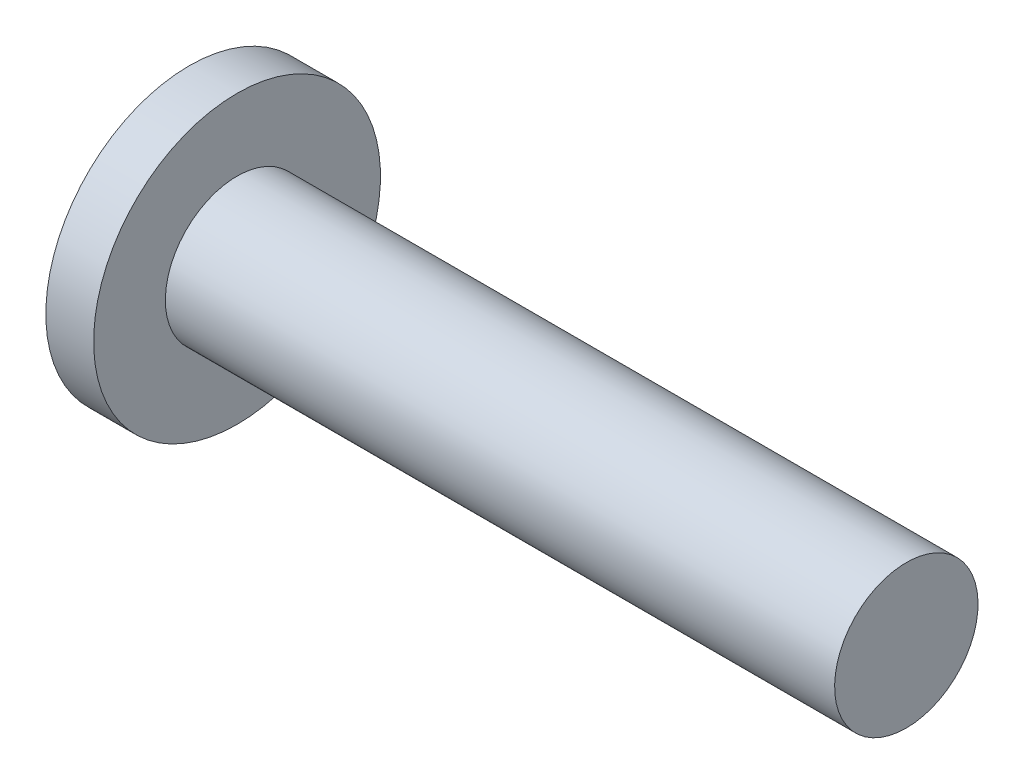
ISO-10303-21;
HEADER;
FILE_DESCRIPTION(('STEP AP214'),'2;1');
FILE_NAME('part.step','',(''),(''),'','','');
FILE_SCHEMA(('AUTOMOTIVE_DESIGN { 1 0 10303 214 1 1 1 1 }'));
ENDSEC;
DATA;
#1=APPLICATION_CONTEXT('core data for automotive mechanical design processes');
#2=APPLICATION_PROTOCOL_DEFINITION('international standard','automotive_design',2000,#1);
#3=PRODUCT_CONTEXT('',#1,'mechanical');
#4=PRODUCT('Part','Part','',(#3));
#5=PRODUCT_RELATED_PRODUCT_CATEGORY('part','',(#4));
#6=PRODUCT_DEFINITION_FORMATION('','',#4);
#7=PRODUCT_DEFINITION_CONTEXT('part definition',#1,'design');
#8=PRODUCT_DEFINITION('design','',#6,#7);
#9=PRODUCT_DEFINITION_SHAPE('','',#8);
#10=(LENGTH_UNIT() NAMED_UNIT(*) SI_UNIT(.MILLI.,.METRE.));
#11=(NAMED_UNIT(*) PLANE_ANGLE_UNIT() SI_UNIT($,.RADIAN.));
#12=(NAMED_UNIT(*) SI_UNIT($,.STERADIAN.) SOLID_ANGLE_UNIT());
#13=UNCERTAINTY_MEASURE_WITH_UNIT(LENGTH_MEASURE(1.E-05),#10,'distance_accuracy_value','');
#14=(GEOMETRIC_REPRESENTATION_CONTEXT(3) GLOBAL_UNCERTAINTY_ASSIGNED_CONTEXT((#13)) GLOBAL_UNIT_ASSIGNED_CONTEXT((#10,
#11,#12)) REPRESENTATION_CONTEXT('',''));
#15=CARTESIAN_POINT('',(0.,0.,0.));
#16=DIRECTION('',(0.,0.,1.));
#17=DIRECTION('',(1.,0.,0.));
#18=AXIS2_PLACEMENT_3D('',#15,#16,#17);
#19=CARTESIAN_POINT('',(0.,0.,0.));
#20=DIRECTION('',(-1.,0.,0.));
#21=DIRECTION('',(0.,-1.,0.));
#22=AXIS2_PLACEMENT_3D('',#19,#20,#21);
#23=PLANE('',#22);
#24=CARTESIAN_POINT('',(0.,-1.5,0.));
#25=DIRECTION('',(-1.,0.,0.));
#26=DIRECTION('',(0.,-1.,0.));
#27=AXIS2_PLACEMENT_3D('',#24,#25,#26);
#28=CIRCLE('',#27,3.);
#29=CARTESIAN_POINT('',(0.,-4.5,0.));
#30=VERTEX_POINT('',#29);
#31=EDGE_CURVE('E10',#30,#30,#28,.T.);
#32=ORIENTED_EDGE('',*,*,#31,.F.);
#33=EDGE_LOOP('',(#32));
#34=FACE_BOUND('',#33,.T.);
#35=CARTESIAN_POINT('',(0.,-1.5,0.));
#36=DIRECTION('',(-1.,0.,0.));
#37=DIRECTION('',(0.,-1.,0.));
#38=AXIS2_PLACEMENT_3D('',#35,#36,#37);
#39=CIRCLE('',#38,1.5);
#40=CARTESIAN_POINT('',(0.,-3.,0.));
#41=VERTEX_POINT('',#40);
#42=EDGE_CURVE('E51',#41,#41,#39,.T.);
#43=ORIENTED_EDGE('',*,*,#42,.T.);
#44=EDGE_LOOP('',(#43));
#45=FACE_BOUND('',#44,.T.);
#46=ADVANCED_FACE('F37',(#34,#45),#23,.F.);
#47=CARTESIAN_POINT('',(-1.,-1.5,0.));
#48=DIRECTION('',(-1.,0.,0.));
#49=DIRECTION('',(0.,-1.,0.));
#50=AXIS2_PLACEMENT_3D('',#47,#48,#49);
#51=CYLINDRICAL_SURFACE('',#50,3.);
#52=CARTESIAN_POINT('',(-1.,-1.5,0.));
#53=DIRECTION('',(-1.,0.,0.));
#54=DIRECTION('',(0.,-1.,0.));
#55=AXIS2_PLACEMENT_3D('',#52,#53,#54);
#56=CIRCLE('',#55,3.);
#57=CARTESIAN_POINT('',(-1.,-4.5,0.));
#58=VERTEX_POINT('',#57);
#59=EDGE_CURVE('E43',#58,#58,#56,.T.);
#60=ORIENTED_EDGE('',*,*,#59,.F.);
#61=EDGE_LOOP('',(#60));
#62=FACE_BOUND('',#61,.T.);
#63=ORIENTED_EDGE('',*,*,#31,.T.);
#64=EDGE_LOOP('',(#63));
#65=FACE_BOUND('',#64,.T.);
#66=ADVANCED_FACE('F71',(#62,#65),#51,.T.);
#67=CARTESIAN_POINT('',(-1.,1.5,0.));
#68=DIRECTION('',(1.,0.,0.));
#69=DIRECTION('',(0.,1.,0.));
#70=AXIS2_PLACEMENT_3D('',#67,#68,#69);
#71=PLANE('',#70);
#72=ORIENTED_EDGE('',*,*,#59,.T.);
#73=EDGE_LOOP('',(#72));
#74=FACE_BOUND('',#73,.T.);
#75=ADVANCED_FACE('F66',(#74),#71,.F.);
#76=CARTESIAN_POINT('',(14.,0.,0.));
#77=DIRECTION('',(-1.,0.,0.));
#78=DIRECTION('',(0.,-1.,0.));
#79=AXIS2_PLACEMENT_3D('',#76,#77,#78);
#80=PLANE('',#79);
#81=CARTESIAN_POINT('',(14.,-1.5,0.));
#82=DIRECTION('',(-1.,0.,0.));
#83=DIRECTION('',(0.,-1.,0.));
#84=AXIS2_PLACEMENT_3D('',#81,#82,#83);
#85=CIRCLE('',#84,1.5);
#86=CARTESIAN_POINT('',(14.,-3.,0.));
#87=VERTEX_POINT('',#86);
#88=EDGE_CURVE('E47',#87,#87,#85,.T.);
#89=ORIENTED_EDGE('',*,*,#88,.F.);
#90=EDGE_LOOP('',(#89));
#91=FACE_BOUND('',#90,.T.);
#92=ADVANCED_FACE('F61',(#91),#80,.F.);
#93=CARTESIAN_POINT('',(-1.,-1.5,0.));
#94=DIRECTION('',(-1.,0.,0.));
#95=DIRECTION('',(0.,-1.,0.));
#96=AXIS2_PLACEMENT_3D('',#93,#94,#95);
#97=CYLINDRICAL_SURFACE('',#96,1.5);
#98=ORIENTED_EDGE('',*,*,#42,.F.);
#99=EDGE_LOOP('',(#98));
#100=FACE_BOUND('',#99,.T.);
#101=ORIENTED_EDGE('',*,*,#88,.T.);
#102=EDGE_LOOP('',(#101));
#103=FACE_BOUND('',#102,.T.);
#104=ADVANCED_FACE('F58',(#100,#103),#97,.T.);
#105=CLOSED_SHELL('',(#46,#66,#75,#92,#104));
#106=MANIFOLD_SOLID_BREP('B2',#105);
#107=ADVANCED_BREP_SHAPE_REPRESENTATION('',(#18,#106),#14);
#108=SHAPE_DEFINITION_REPRESENTATION(#9,#107);
ENDSEC;
END-ISO-10303-21;
